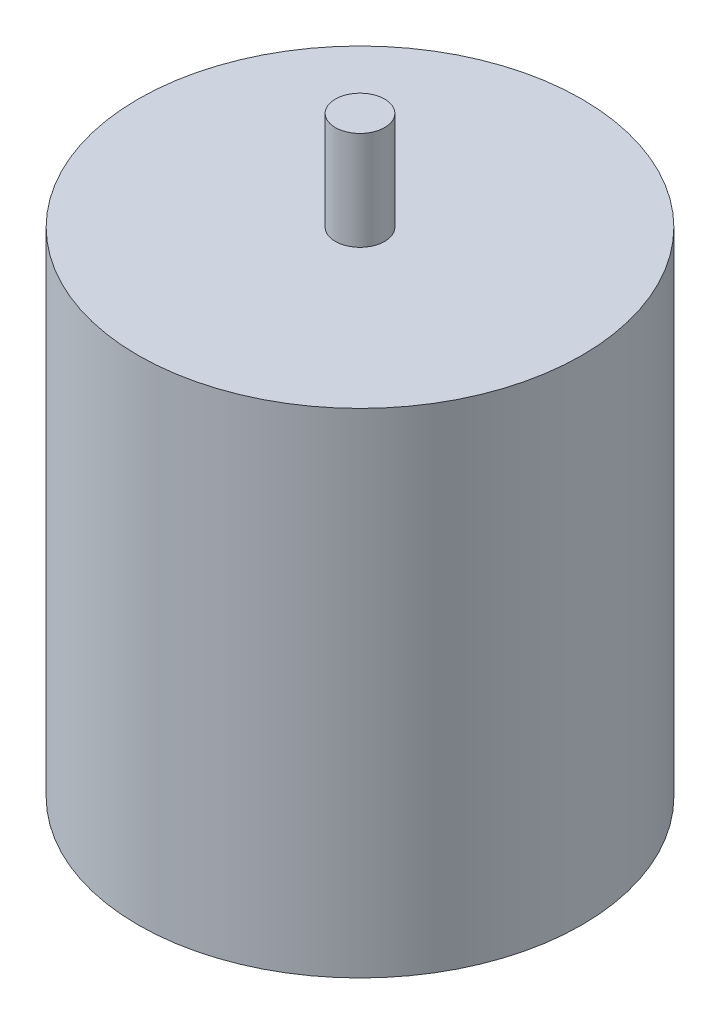
ISO-10303-21;
HEADER;
FILE_DESCRIPTION(('STEP AP214'),'2;1');
FILE_NAME('part.step','',(''),(''),'','','');
FILE_SCHEMA(('AUTOMOTIVE_DESIGN { 1 0 10303 214 1 1 1 1 }'));
ENDSEC;
DATA;
#1=APPLICATION_CONTEXT('core data for automotive mechanical design processes');
#2=APPLICATION_PROTOCOL_DEFINITION('international standard','automotive_design',2000,#1);
#3=PRODUCT_CONTEXT('',#1,'mechanical');
#4=PRODUCT('Part','Part','',(#3));
#5=PRODUCT_RELATED_PRODUCT_CATEGORY('part','',(#4));
#6=PRODUCT_DEFINITION_FORMATION('','',#4);
#7=PRODUCT_DEFINITION_CONTEXT('part definition',#1,'design');
#8=PRODUCT_DEFINITION('design','',#6,#7);
#9=PRODUCT_DEFINITION_SHAPE('','',#8);
#10=(LENGTH_UNIT() NAMED_UNIT(*) SI_UNIT(.MILLI.,.METRE.));
#11=(NAMED_UNIT(*) PLANE_ANGLE_UNIT() SI_UNIT($,.RADIAN.));
#12=(NAMED_UNIT(*) SI_UNIT($,.STERADIAN.) SOLID_ANGLE_UNIT());
#13=UNCERTAINTY_MEASURE_WITH_UNIT(LENGTH_MEASURE(1.E-05),#10,'distance_accuracy_value','');
#14=(GEOMETRIC_REPRESENTATION_CONTEXT(3) GLOBAL_UNCERTAINTY_ASSIGNED_CONTEXT((#13)) GLOBAL_UNIT_ASSIGNED_CONTEXT((#10,
#11,#12)) REPRESENTATION_CONTEXT('',''));
#15=CARTESIAN_POINT('',(0.,0.,0.));
#16=DIRECTION('',(0.,0.,1.));
#17=DIRECTION('',(1.,0.,0.));
#18=AXIS2_PLACEMENT_3D('',#15,#16,#17);
#19=CARTESIAN_POINT('',(0.,100.,0.));
#20=DIRECTION('',(0.,-1.,0.));
#21=DIRECTION('',(0.,0.,-1.));
#22=AXIS2_PLACEMENT_3D('',#19,#20,#21);
#23=CYLINDRICAL_SURFACE('',#22,44.9950855666708);
#24=CARTESIAN_POINT('',(0.,100.,0.));
#25=DIRECTION('',(0.,1.,0.));
#26=DIRECTION('',(0.,0.,1.));
#27=AXIS2_PLACEMENT_3D('',#24,#25,#26);
#28=CIRCLE('',#27,44.9950855666708);
#29=CARTESIAN_POINT('',(0.,100.,44.9950855666708));
#30=VERTEX_POINT('',#29);
#31=EDGE_CURVE('E10',#30,#30,#28,.T.);
#32=ORIENTED_EDGE('',*,*,#31,.F.);
#33=EDGE_LOOP('',(#32));
#34=FACE_BOUND('',#33,.T.);
#35=CARTESIAN_POINT('',(0.,0.,0.));
#36=DIRECTION('',(0.,1.,0.));
#37=DIRECTION('',(0.,0.,1.));
#38=AXIS2_PLACEMENT_3D('',#35,#36,#37);
#39=CIRCLE('',#38,44.9950855666708);
#40=CARTESIAN_POINT('',(0.,0.,44.9950855666708));
#41=VERTEX_POINT('',#40);
#42=EDGE_CURVE('E40',#41,#41,#39,.T.);
#43=ORIENTED_EDGE('',*,*,#42,.T.);
#44=EDGE_LOOP('',(#43));
#45=FACE_BOUND('',#44,.T.);
#46=ADVANCED_FACE('F37',(#34,#45),#23,.T.);
#47=CARTESIAN_POINT('',(0.,100.,0.));
#48=DIRECTION('',(0.,1.,0.));
#49=DIRECTION('',(0.,0.,1.));
#50=AXIS2_PLACEMENT_3D('',#47,#48,#49);
#51=PLANE('',#50);
#52=CARTESIAN_POINT('',(0.,100.,0.));
#53=DIRECTION('',(0.,1.,0.));
#54=DIRECTION('',(0.,0.,1.));
#55=AXIS2_PLACEMENT_3D('',#52,#53,#54);
#56=CIRCLE('',#55,5.);
#57=CARTESIAN_POINT('',(0.,100.,5.));
#58=VERTEX_POINT('',#57);
#59=EDGE_CURVE('E51',#58,#58,#56,.T.);
#60=ORIENTED_EDGE('',*,*,#59,.F.);
#61=EDGE_LOOP('',(#60));
#62=FACE_BOUND('',#61,.T.);
#63=ORIENTED_EDGE('',*,*,#31,.T.);
#64=EDGE_LOOP('',(#63));
#65=FACE_BOUND('',#64,.T.);
#66=ADVANCED_FACE('F68',(#62,#65),#51,.T.);
#67=CARTESIAN_POINT('',(0.,0.,0.));
#68=DIRECTION('',(0.,1.,0.));
#69=DIRECTION('',(0.,0.,1.));
#70=AXIS2_PLACEMENT_3D('',#67,#68,#69);
#71=PLANE('',#70);
#72=ORIENTED_EDGE('',*,*,#42,.F.);
#73=EDGE_LOOP('',(#72));
#74=FACE_BOUND('',#73,.T.);
#75=ADVANCED_FACE('F64',(#74),#71,.F.);
#76=CARTESIAN_POINT('',(0.,120.,0.));
#77=DIRECTION('',(0.,-1.,0.));
#78=DIRECTION('',(0.,0.,-1.));
#79=AXIS2_PLACEMENT_3D('',#76,#77,#78);
#80=CYLINDRICAL_SURFACE('',#79,5.);
#81=CARTESIAN_POINT('',(0.,120.,0.));
#82=DIRECTION('',(0.,1.,0.));
#83=DIRECTION('',(0.,0.,1.));
#84=AXIS2_PLACEMENT_3D('',#81,#82,#83);
#85=CIRCLE('',#84,5.);
#86=CARTESIAN_POINT('',(0.,120.,5.));
#87=VERTEX_POINT('',#86);
#88=EDGE_CURVE('E49',#87,#87,#85,.T.);
#89=ORIENTED_EDGE('',*,*,#88,.F.);
#90=EDGE_LOOP('',(#89));
#91=FACE_BOUND('',#90,.T.);
#92=ORIENTED_EDGE('',*,*,#59,.T.);
#93=EDGE_LOOP('',(#92));
#94=FACE_BOUND('',#93,.T.);
#95=ADVANCED_FACE('F61',(#91,#94),#80,.T.);
#96=CARTESIAN_POINT('',(0.,120.,0.));
#97=DIRECTION('',(0.,1.,0.));
#98=DIRECTION('',(0.,0.,1.));
#99=AXIS2_PLACEMENT_3D('',#96,#97,#98);
#100=PLANE('',#99);
#101=ORIENTED_EDGE('',*,*,#88,.T.);
#102=EDGE_LOOP('',(#101));
#103=FACE_BOUND('',#102,.T.);
#104=ADVANCED_FACE('F59',(#103),#100,.T.);
#105=CLOSED_SHELL('',(#46,#66,#75,#95,#104));
#106=MANIFOLD_SOLID_BREP('B2',#105);
#107=ADVANCED_BREP_SHAPE_REPRESENTATION('',(#18,#106),#14);
#108=SHAPE_DEFINITION_REPRESENTATION(#9,#107);
ENDSEC;
END-ISO-10303-21;
